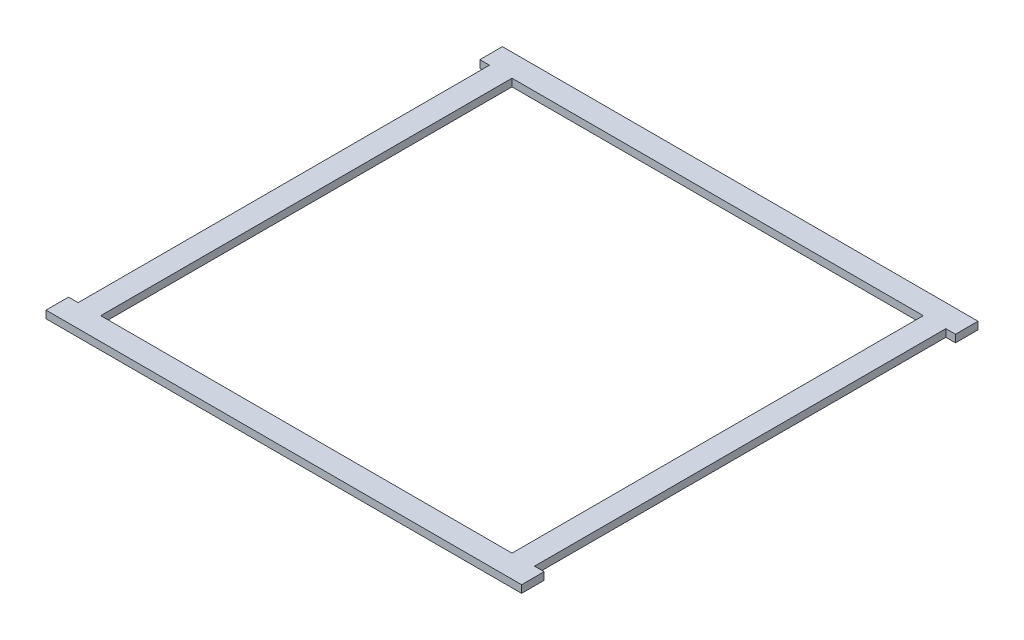
ISO-10303-21;
HEADER;
FILE_DESCRIPTION(('STEP AP214'),'2;1');
FILE_NAME('part.step','',(''),(''),'','','');
FILE_SCHEMA(('AUTOMOTIVE_DESIGN { 1 0 10303 214 1 1 1 1 }'));
ENDSEC;
DATA;
#1=APPLICATION_CONTEXT('core data for automotive mechanical design processes');
#2=APPLICATION_PROTOCOL_DEFINITION('international standard','automotive_design',2000,#1);
#3=PRODUCT_CONTEXT('',#1,'mechanical');
#4=PRODUCT('Part','Part','',(#3));
#5=PRODUCT_RELATED_PRODUCT_CATEGORY('part','',(#4));
#6=PRODUCT_DEFINITION_FORMATION('','',#4);
#7=PRODUCT_DEFINITION_CONTEXT('part definition',#1,'design');
#8=PRODUCT_DEFINITION('design','',#6,#7);
#9=PRODUCT_DEFINITION_SHAPE('','',#8);
#10=(LENGTH_UNIT() NAMED_UNIT(*) SI_UNIT(.MILLI.,.METRE.));
#11=(NAMED_UNIT(*) PLANE_ANGLE_UNIT() SI_UNIT($,.RADIAN.));
#12=(NAMED_UNIT(*) SI_UNIT($,.STERADIAN.) SOLID_ANGLE_UNIT());
#13=UNCERTAINTY_MEASURE_WITH_UNIT(LENGTH_MEASURE(1.E-05),#10,'distance_accuracy_value','');
#14=(GEOMETRIC_REPRESENTATION_CONTEXT(3) GLOBAL_UNCERTAINTY_ASSIGNED_CONTEXT((#13)) GLOBAL_UNIT_ASSIGNED_CONTEXT((#10,
#11,#12)) REPRESENTATION_CONTEXT('',''));
#15=CARTESIAN_POINT('',(0.,0.,0.));
#16=DIRECTION('',(0.,0.,1.));
#17=DIRECTION('',(1.,0.,0.));
#18=AXIS2_PLACEMENT_3D('',#15,#16,#17);
#19=CARTESIAN_POINT('',(19.05,0.,347.599));
#20=DIRECTION('',(0.,1.,0.));
#21=DIRECTION('',(0.,0.,1.));
#22=AXIS2_PLACEMENT_3D('',#19,#20,#21);
#23=PLANE('',#22);
#24=DIRECTION('',(-1.,0.,0.));
#25=VECTOR('',#24,1.);
#26=CARTESIAN_POINT('',(393.827,0.,0.));
#27=LINE('',#26,#25);
#28=CARTESIAN_POINT('',(19.05,0.,0.));
#29=VERTEX_POINT('',#28);
#30=CARTESIAN_POINT('',(366.649,0.,0.));
#31=VERTEX_POINT('',#30);
#32=EDGE_CURVE('E197',#29,#31,#27,.F.);
#33=ORIENTED_EDGE('',*,*,#32,.T.);
#34=DIRECTION('',(0.,0.,-1.));
#35=VECTOR('',#34,1.);
#36=CARTESIAN_POINT('',(366.649,0.,347.599));
#37=LINE('',#36,#35);
#38=CARTESIAN_POINT('',(366.649,0.,347.599));
#39=VERTEX_POINT('',#38);
#40=EDGE_CURVE('E202',#31,#39,#37,.F.);
#41=ORIENTED_EDGE('',*,*,#40,.T.);
#42=DIRECTION('',(1.,0.,0.));
#43=VECTOR('',#42,1.);
#44=CARTESIAN_POINT('',(-8.128,0.,347.599));
#45=LINE('',#44,#43);
#46=CARTESIAN_POINT('',(19.05,0.,347.599));
#47=VERTEX_POINT('',#46);
#48=EDGE_CURVE('E207',#39,#47,#45,.F.);
#49=ORIENTED_EDGE('',*,*,#48,.T.);
#50=DIRECTION('',(0.,0.,1.));
#51=VECTOR('',#50,1.);
#52=CARTESIAN_POINT('',(19.05,0.,347.599));
#53=LINE('',#52,#51);
#54=EDGE_CURVE('E213',#47,#29,#53,.F.);
#55=ORIENTED_EDGE('',*,*,#54,.T.);
#56=EDGE_LOOP('',(#33,#41,#49,#55));
#57=FACE_BOUND('',#56,.T.);
#58=DIRECTION('',(0.,0.,-1.));
#59=VECTOR('',#58,1.);
#60=CARTESIAN_POINT('',(-8.128,0.,0.));
#61=LINE('',#60,#59);
#62=CARTESIAN_POINT('',(-8.12799999999999,0.,-19.05));
#63=VERTEX_POINT('',#62);
#64=CARTESIAN_POINT('',(-8.12800000000001,0.,0.));
#65=VERTEX_POINT('',#64);
#66=EDGE_CURVE('E179',#63,#65,#61,.F.);
#67=ORIENTED_EDGE('',*,*,#66,.T.);
#68=DIRECTION('',(-1.,0.,0.));
#69=VECTOR('',#68,1.);
#70=CARTESIAN_POINT('',(393.827,0.,0.));
#71=LINE('',#70,#69);
#72=CARTESIAN_POINT('',(0.,0.,0.));
#73=VERTEX_POINT('',#72);
#74=EDGE_CURVE('E184',#65,#73,#71,.F.);
#75=ORIENTED_EDGE('',*,*,#74,.T.);
#76=DIRECTION('',(0.,0.,-1.));
#77=VECTOR('',#76,1.);
#78=CARTESIAN_POINT('',(0.,0.,347.599));
#79=LINE('',#78,#77);
#80=CARTESIAN_POINT('',(0.,0.,347.599));
#81=VERTEX_POINT('',#80);
#82=EDGE_CURVE('E189',#73,#81,#79,.F.);
#83=ORIENTED_EDGE('',*,*,#82,.T.);
#84=DIRECTION('',(1.,0.,0.));
#85=VECTOR('',#84,1.);
#86=CARTESIAN_POINT('',(-8.128,0.,347.599));
#87=LINE('',#86,#85);
#88=CARTESIAN_POINT('',(-8.12800000000001,0.,347.599));
#89=VERTEX_POINT('',#88);
#90=EDGE_CURVE('E130',#81,#89,#87,.F.);
#91=ORIENTED_EDGE('',*,*,#90,.T.);
#92=DIRECTION('',(0.,0.,-1.));
#93=VECTOR('',#92,1.);
#94=CARTESIAN_POINT('',(-8.128,0.,366.649));
#95=LINE('',#94,#93);
#96=CARTESIAN_POINT('',(-8.12800000000001,0.,366.649));
#97=VERTEX_POINT('',#96);
#98=EDGE_CURVE('E19',#89,#97,#95,.F.);
#99=ORIENTED_EDGE('',*,*,#98,.T.);
#100=DIRECTION('',(-1.,0.,0.));
#101=VECTOR('',#100,1.);
#102=CARTESIAN_POINT('',(393.827,0.,366.649));
#103=LINE('',#102,#101);
#104=CARTESIAN_POINT('',(393.827,0.,366.649));
#105=VERTEX_POINT('',#104);
#106=EDGE_CURVE('E126',#97,#105,#103,.F.);
#107=ORIENTED_EDGE('',*,*,#106,.T.);
#108=DIRECTION('',(0.,0.,1.));
#109=VECTOR('',#108,1.);
#110=CARTESIAN_POINT('',(393.827,0.,347.599));
#111=LINE('',#110,#109);
#112=CARTESIAN_POINT('',(393.827,0.,347.599));
#113=VERTEX_POINT('',#112);
#114=EDGE_CURVE('E148',#105,#113,#111,.F.);
#115=ORIENTED_EDGE('',*,*,#114,.T.);
#116=DIRECTION('',(1.,0.,0.));
#117=VECTOR('',#116,1.);
#118=CARTESIAN_POINT('',(-8.128,0.,347.599));
#119=LINE('',#118,#117);
#120=CARTESIAN_POINT('',(385.699,0.,347.599));
#121=VERTEX_POINT('',#120);
#122=EDGE_CURVE('E153',#113,#121,#119,.F.);
#123=ORIENTED_EDGE('',*,*,#122,.T.);
#124=DIRECTION('',(0.,0.,1.));
#125=VECTOR('',#124,1.);
#126=CARTESIAN_POINT('',(385.699,0.,5.27355936696949E-13));
#127=LINE('',#126,#125);
#128=CARTESIAN_POINT('',(385.699,0.,0.));
#129=VERTEX_POINT('',#128);
#130=EDGE_CURVE('E158',#121,#129,#127,.F.);
#131=ORIENTED_EDGE('',*,*,#130,.T.);
#132=DIRECTION('',(-1.,0.,0.));
#133=VECTOR('',#132,1.);
#134=CARTESIAN_POINT('',(393.827,0.,0.));
#135=LINE('',#134,#133);
#136=CARTESIAN_POINT('',(393.827,0.,0.));
#137=VERTEX_POINT('',#136);
#138=EDGE_CURVE('E161',#129,#137,#135,.F.);
#139=ORIENTED_EDGE('',*,*,#138,.T.);
#140=DIRECTION('',(0.,0.,1.));
#141=VECTOR('',#140,1.);
#142=CARTESIAN_POINT('',(393.827,0.,-19.05));
#143=LINE('',#142,#141);
#144=CARTESIAN_POINT('',(393.827,0.,-19.05));
#145=VERTEX_POINT('',#144);
#146=EDGE_CURVE('E169',#137,#145,#143,.F.);
#147=ORIENTED_EDGE('',*,*,#146,.T.);
#148=DIRECTION('',(1.,0.,0.));
#149=VECTOR('',#148,1.);
#150=CARTESIAN_POINT('',(-8.128,0.,-19.05));
#151=LINE('',#150,#149);
#152=EDGE_CURVE('E174',#145,#63,#151,.F.);
#153=ORIENTED_EDGE('',*,*,#152,.T.);
#154=EDGE_LOOP('',(#67,#75,#83,#91,#99,#107,#115,#123,#131,#139,#147,#153));
#155=FACE_BOUND('',#154,.T.);
#156=ADVANCED_FACE('F16',(#57,#155),#23,.T.);
#157=CARTESIAN_POINT('',(-8.128,-6.35,366.649));
#158=DIRECTION('',(1.,0.,0.));
#159=DIRECTION('',(0.,0.,-1.));
#160=AXIS2_PLACEMENT_3D('',#157,#158,#159);
#161=PLANE('',#160);
#162=DIRECTION('',(0.,1.,0.));
#163=VECTOR('',#162,1.);
#164=CARTESIAN_POINT('',(-8.128,-6.35,347.599));
#165=LINE('',#164,#163);
#166=CARTESIAN_POINT('',(-8.12800000000001,-6.35,347.599));
#167=VERTEX_POINT('',#166);
#168=EDGE_CURVE('E191',#89,#167,#165,.F.);
#169=ORIENTED_EDGE('',*,*,#168,.T.);
#170=DIRECTION('',(0.,0.,1.));
#171=VECTOR('',#170,1.);
#172=CARTESIAN_POINT('',(-8.128,-6.35,347.599));
#173=LINE('',#172,#171);
#174=CARTESIAN_POINT('',(-8.12800000000001,-6.35,366.649));
#175=VERTEX_POINT('',#174);
#176=EDGE_CURVE('E145',#167,#175,#173,.T.);
#177=ORIENTED_EDGE('',*,*,#176,.T.);
#178=DIRECTION('',(0.,1.,0.));
#179=VECTOR('',#178,1.);
#180=CARTESIAN_POINT('',(-8.12800000000002,-6.35,366.649));
#181=LINE('',#180,#179);
#182=EDGE_CURVE('E135',#175,#97,#181,.T.);
#183=ORIENTED_EDGE('',*,*,#182,.T.);
#184=ORIENTED_EDGE('',*,*,#98,.F.);
#185=EDGE_LOOP('',(#169,#177,#183,#184));
#186=FACE_BOUND('',#185,.T.);
#187=ADVANCED_FACE('F144',(#186),#161,.F.);
#188=CARTESIAN_POINT('',(393.827,-6.35,366.649));
#189=DIRECTION('',(0.,0.,-1.));
#190=DIRECTION('',(-1.,0.,0.));
#191=AXIS2_PLACEMENT_3D('',#188,#189,#190);
#192=PLANE('',#191);
#193=ORIENTED_EDGE('',*,*,#182,.F.);
#194=DIRECTION('',(1.,0.,0.));
#195=VECTOR('',#194,1.);
#196=CARTESIAN_POINT('',(19.05,-6.35,366.649));
#197=LINE('',#196,#195);
#198=CARTESIAN_POINT('',(393.827,-6.35,366.649));
#199=VERTEX_POINT('',#198);
#200=EDGE_CURVE('E217',#175,#199,#197,.T.);
#201=ORIENTED_EDGE('',*,*,#200,.T.);
#202=DIRECTION('',(0.,1.,0.));
#203=VECTOR('',#202,1.);
#204=CARTESIAN_POINT('',(393.827,-6.35,366.649));
#205=LINE('',#204,#203);
#206=EDGE_CURVE('E141',#199,#105,#205,.T.);
#207=ORIENTED_EDGE('',*,*,#206,.T.);
#208=ORIENTED_EDGE('',*,*,#106,.F.);
#209=EDGE_LOOP('',(#193,#201,#207,#208));
#210=FACE_BOUND('',#209,.T.);
#211=ADVANCED_FACE('F138',(#210),#192,.F.);
#212=CARTESIAN_POINT('',(393.827,-6.35,347.599));
#213=DIRECTION('',(-1.,0.,0.));
#214=DIRECTION('',(0.,0.,1.));
#215=AXIS2_PLACEMENT_3D('',#212,#213,#214);
#216=PLANE('',#215);
#217=ORIENTED_EDGE('',*,*,#206,.F.);
#218=DIRECTION('',(0.,0.,1.));
#219=VECTOR('',#218,1.);
#220=CARTESIAN_POINT('',(393.827,-6.35,347.599));
#221=LINE('',#220,#219);
#222=CARTESIAN_POINT('',(393.827,-6.35,347.599));
#223=VERTEX_POINT('',#222);
#224=EDGE_CURVE('E219',#199,#223,#221,.F.);
#225=ORIENTED_EDGE('',*,*,#224,.T.);
#226=DIRECTION('',(0.,1.,0.));
#227=VECTOR('',#226,1.);
#228=CARTESIAN_POINT('',(393.827,-6.35,347.599));
#229=LINE('',#228,#227);
#230=EDGE_CURVE('E150',#223,#113,#229,.T.);
#231=ORIENTED_EDGE('',*,*,#230,.T.);
#232=ORIENTED_EDGE('',*,*,#114,.F.);
#233=EDGE_LOOP('',(#217,#225,#231,#232));
#234=FACE_BOUND('',#233,.T.);
#235=ADVANCED_FACE('F320',(#234),#216,.F.);
#236=CARTESIAN_POINT('',(-8.128,-6.35,347.599));
#237=DIRECTION('',(0.,0.,1.));
#238=DIRECTION('',(1.,0.,0.));
#239=AXIS2_PLACEMENT_3D('',#236,#237,#238);
#240=PLANE('',#239);
#241=DIRECTION('',(0.,1.,0.));
#242=VECTOR('',#241,1.);
#243=CARTESIAN_POINT('',(385.698999999999,-6.35,347.599));
#244=LINE('',#243,#242);
#245=CARTESIAN_POINT('',(385.699,-6.35,347.599));
#246=VERTEX_POINT('',#245);
#247=EDGE_CURVE('E155',#246,#121,#244,.T.);
#248=ORIENTED_EDGE('',*,*,#247,.T.);
#249=ORIENTED_EDGE('',*,*,#122,.F.);
#250=ORIENTED_EDGE('',*,*,#230,.F.);
#251=DIRECTION('',(1.,0.,0.));
#252=VECTOR('',#251,1.);
#253=CARTESIAN_POINT('',(19.05,-6.35,347.599));
#254=LINE('',#253,#252);
#255=EDGE_CURVE('E222',#223,#246,#254,.F.);
#256=ORIENTED_EDGE('',*,*,#255,.T.);
#257=EDGE_LOOP('',(#248,#249,#250,#256));
#258=FACE_BOUND('',#257,.T.);
#259=ADVANCED_FACE('F316',(#258),#240,.F.);
#260=CARTESIAN_POINT('',(385.699,-6.35,5.27355936696949E-13));
#261=DIRECTION('',(-1.,0.,0.));
#262=DIRECTION('',(0.,0.,1.));
#263=AXIS2_PLACEMENT_3D('',#260,#261,#262);
#264=PLANE('',#263);
#265=ORIENTED_EDGE('',*,*,#247,.F.);
#266=DIRECTION('',(0.,0.,1.));
#267=VECTOR('',#266,1.);
#268=CARTESIAN_POINT('',(385.699,-6.35,347.599));
#269=LINE('',#268,#267);
#270=CARTESIAN_POINT('',(385.699,-6.35,0.));
#271=VERTEX_POINT('',#270);
#272=EDGE_CURVE('E225',#246,#271,#269,.F.);
#273=ORIENTED_EDGE('',*,*,#272,.T.);
#274=DIRECTION('',(0.,1.,0.));
#275=VECTOR('',#274,1.);
#276=CARTESIAN_POINT('',(385.699,-6.35,0.));
#277=LINE('',#276,#275);
#278=EDGE_CURVE('E163',#271,#129,#277,.T.);
#279=ORIENTED_EDGE('',*,*,#278,.T.);
#280=ORIENTED_EDGE('',*,*,#130,.F.);
#281=EDGE_LOOP('',(#265,#273,#279,#280));
#282=FACE_BOUND('',#281,.T.);
#283=ADVANCED_FACE('F312',(#282),#264,.F.);
#284=CARTESIAN_POINT('',(393.827,-6.35,0.));
#285=DIRECTION('',(0.,0.,-1.));
#286=DIRECTION('',(-1.,0.,0.));
#287=AXIS2_PLACEMENT_3D('',#284,#285,#286);
#288=PLANE('',#287);
#289=DIRECTION('',(1.,0.,0.));
#290=VECTOR('',#289,1.);
#291=CARTESIAN_POINT('',(19.05,-6.35,0.));
#292=LINE('',#291,#290);
#293=CARTESIAN_POINT('',(393.827,-6.35,0.));
#294=VERTEX_POINT('',#293);
#295=EDGE_CURVE('E228',#271,#294,#292,.T.);
#296=ORIENTED_EDGE('',*,*,#295,.T.);
#297=DIRECTION('',(0.,1.,0.));
#298=VECTOR('',#297,1.);
#299=CARTESIAN_POINT('',(393.827,-6.35,0.));
#300=LINE('',#299,#298);
#301=EDGE_CURVE('E166',#294,#137,#300,.T.);
#302=ORIENTED_EDGE('',*,*,#301,.T.);
#303=ORIENTED_EDGE('',*,*,#138,.F.);
#304=ORIENTED_EDGE('',*,*,#278,.F.);
#305=EDGE_LOOP('',(#296,#302,#303,#304));
#306=FACE_BOUND('',#305,.T.);
#307=ADVANCED_FACE('F308',(#306),#288,.F.);
#308=CARTESIAN_POINT('',(393.827,-6.35,-19.05));
#309=DIRECTION('',(-1.,0.,0.));
#310=DIRECTION('',(0.,0.,1.));
#311=AXIS2_PLACEMENT_3D('',#308,#309,#310);
#312=PLANE('',#311);
#313=ORIENTED_EDGE('',*,*,#301,.F.);
#314=DIRECTION('',(0.,0.,1.));
#315=VECTOR('',#314,1.);
#316=CARTESIAN_POINT('',(393.827,-6.35,347.599));
#317=LINE('',#316,#315);
#318=CARTESIAN_POINT('',(393.827,-6.35,-19.05));
#319=VERTEX_POINT('',#318);
#320=EDGE_CURVE('E231',#294,#319,#317,.F.);
#321=ORIENTED_EDGE('',*,*,#320,.T.);
#322=DIRECTION('',(0.,1.,0.));
#323=VECTOR('',#322,1.);
#324=CARTESIAN_POINT('',(393.827,-6.35,-19.05));
#325=LINE('',#324,#323);
#326=EDGE_CURVE('E171',#319,#145,#325,.T.);
#327=ORIENTED_EDGE('',*,*,#326,.T.);
#328=ORIENTED_EDGE('',*,*,#146,.F.);
#329=EDGE_LOOP('',(#313,#321,#327,#328));
#330=FACE_BOUND('',#329,.T.);
#331=ADVANCED_FACE('F304',(#330),#312,.F.);
#332=CARTESIAN_POINT('',(-8.128,-6.35,-19.05));
#333=DIRECTION('',(0.,0.,1.));
#334=DIRECTION('',(1.,0.,0.));
#335=AXIS2_PLACEMENT_3D('',#332,#333,#334);
#336=PLANE('',#335);
#337=ORIENTED_EDGE('',*,*,#326,.F.);
#338=DIRECTION('',(1.,0.,0.));
#339=VECTOR('',#338,1.);
#340=CARTESIAN_POINT('',(19.05,-6.35,-19.05));
#341=LINE('',#340,#339);
#342=CARTESIAN_POINT('',(-8.12799999999999,-6.35,-19.05));
#343=VERTEX_POINT('',#342);
#344=EDGE_CURVE('E234',#319,#343,#341,.F.);
#345=ORIENTED_EDGE('',*,*,#344,.T.);
#346=DIRECTION('',(0.,1.,0.));
#347=VECTOR('',#346,1.);
#348=CARTESIAN_POINT('',(-8.12799999999997,-6.35,-19.05));
#349=LINE('',#348,#347);
#350=EDGE_CURVE('E176',#343,#63,#349,.T.);
#351=ORIENTED_EDGE('',*,*,#350,.T.);
#352=ORIENTED_EDGE('',*,*,#152,.F.);
#353=EDGE_LOOP('',(#337,#345,#351,#352));
#354=FACE_BOUND('',#353,.T.);
#355=ADVANCED_FACE('F300',(#354),#336,.F.);
#356=CARTESIAN_POINT('',(-8.128,-6.35,0.));
#357=DIRECTION('',(1.,0.,0.));
#358=DIRECTION('',(0.,0.,-1.));
#359=AXIS2_PLACEMENT_3D('',#356,#357,#358);
#360=PLANE('',#359);
#361=ORIENTED_EDGE('',*,*,#350,.F.);
#362=DIRECTION('',(0.,0.,1.));
#363=VECTOR('',#362,1.);
#364=CARTESIAN_POINT('',(-8.128,-6.35,347.599));
#365=LINE('',#364,#363);
#366=CARTESIAN_POINT('',(-8.12800000000001,-6.35,0.));
#367=VERTEX_POINT('',#366);
#368=EDGE_CURVE('E237',#343,#367,#365,.T.);
#369=ORIENTED_EDGE('',*,*,#368,.T.);
#370=DIRECTION('',(0.,1.,0.));
#371=VECTOR('',#370,1.);
#372=CARTESIAN_POINT('',(-8.12800000000002,-6.35,0.));
#373=LINE('',#372,#371);
#374=EDGE_CURVE('E181',#367,#65,#373,.T.);
#375=ORIENTED_EDGE('',*,*,#374,.T.);
#376=ORIENTED_EDGE('',*,*,#66,.F.);
#377=EDGE_LOOP('',(#361,#369,#375,#376));
#378=FACE_BOUND('',#377,.T.);
#379=ADVANCED_FACE('F296',(#378),#360,.F.);
#380=CARTESIAN_POINT('',(393.827,-6.35,0.));
#381=DIRECTION('',(0.,0.,-1.));
#382=DIRECTION('',(-1.,0.,0.));
#383=AXIS2_PLACEMENT_3D('',#380,#381,#382);
#384=PLANE('',#383);
#385=DIRECTION('',(0.,1.,0.));
#386=VECTOR('',#385,1.);
#387=CARTESIAN_POINT('',(0.,-6.35,0.));
#388=LINE('',#387,#386);
#389=CARTESIAN_POINT('',(0.,-6.35,0.));
#390=VERTEX_POINT('',#389);
#391=EDGE_CURVE('E186',#390,#73,#388,.T.);
#392=ORIENTED_EDGE('',*,*,#391,.T.);
#393=ORIENTED_EDGE('',*,*,#74,.F.);
#394=ORIENTED_EDGE('',*,*,#374,.F.);
#395=DIRECTION('',(1.,0.,0.));
#396=VECTOR('',#395,1.);
#397=CARTESIAN_POINT('',(19.05,-6.35,0.));
#398=LINE('',#397,#396);
#399=EDGE_CURVE('E240',#367,#390,#398,.T.);
#400=ORIENTED_EDGE('',*,*,#399,.T.);
#401=EDGE_LOOP('',(#392,#393,#394,#400));
#402=FACE_BOUND('',#401,.T.);
#403=ADVANCED_FACE('F292',(#402),#384,.F.);
#404=CARTESIAN_POINT('',(0.,-6.35,347.599));
#405=DIRECTION('',(1.,0.,0.));
#406=DIRECTION('',(0.,0.,-1.));
#407=AXIS2_PLACEMENT_3D('',#404,#405,#406);
#408=PLANE('',#407);
#409=ORIENTED_EDGE('',*,*,#391,.F.);
#410=DIRECTION('',(0.,0.,1.));
#411=VECTOR('',#410,1.);
#412=CARTESIAN_POINT('',(0.,-6.35,347.599));
#413=LINE('',#412,#411);
#414=CARTESIAN_POINT('',(0.,-6.35,347.599));
#415=VERTEX_POINT('',#414);
#416=EDGE_CURVE('E243',#390,#415,#413,.T.);
#417=ORIENTED_EDGE('',*,*,#416,.T.);
#418=DIRECTION('',(0.,1.,0.));
#419=VECTOR('',#418,1.);
#420=CARTESIAN_POINT('',(0.,-6.35,347.599));
#421=LINE('',#420,#419);
#422=EDGE_CURVE('E193',#415,#81,#421,.T.);
#423=ORIENTED_EDGE('',*,*,#422,.T.);
#424=ORIENTED_EDGE('',*,*,#82,.F.);
#425=EDGE_LOOP('',(#409,#417,#423,#424));
#426=FACE_BOUND('',#425,.T.);
#427=ADVANCED_FACE('F288',(#426),#408,.F.);
#428=CARTESIAN_POINT('',(-8.128,-6.35,347.599));
#429=DIRECTION('',(0.,0.,1.));
#430=DIRECTION('',(1.,0.,0.));
#431=AXIS2_PLACEMENT_3D('',#428,#429,#430);
#432=PLANE('',#431);
#433=ORIENTED_EDGE('',*,*,#422,.F.);
#434=DIRECTION('',(1.,0.,0.));
#435=VECTOR('',#434,1.);
#436=CARTESIAN_POINT('',(19.05,-6.35,347.599));
#437=LINE('',#436,#435);
#438=EDGE_CURVE('E246',#415,#167,#437,.F.);
#439=ORIENTED_EDGE('',*,*,#438,.T.);
#440=ORIENTED_EDGE('',*,*,#168,.F.);
#441=ORIENTED_EDGE('',*,*,#90,.F.);
#442=EDGE_LOOP('',(#433,#439,#440,#441));
#443=FACE_BOUND('',#442,.T.);
#444=ADVANCED_FACE('F285',(#443),#432,.F.);
#445=CARTESIAN_POINT('',(393.827,-6.35,0.));
#446=DIRECTION('',(0.,0.,-1.));
#447=DIRECTION('',(-1.,0.,0.));
#448=AXIS2_PLACEMENT_3D('',#445,#446,#447);
#449=PLANE('',#448);
#450=ORIENTED_EDGE('',*,*,#32,.F.);
#451=DIRECTION('',(0.,1.,0.));
#452=VECTOR('',#451,1.);
#453=CARTESIAN_POINT('',(19.05,-6.35,0.));
#454=LINE('',#453,#452);
#455=CARTESIAN_POINT('',(19.05,-6.35,0.));
#456=VERTEX_POINT('',#455);
#457=EDGE_CURVE('E209',#29,#456,#454,.F.);
#458=ORIENTED_EDGE('',*,*,#457,.T.);
#459=DIRECTION('',(1.,0.,0.));
#460=VECTOR('',#459,1.);
#461=CARTESIAN_POINT('',(19.05,-6.35,0.));
#462=LINE('',#461,#460);
#463=CARTESIAN_POINT('',(366.649,-6.35,0.));
#464=VERTEX_POINT('',#463);
#465=EDGE_CURVE('E249',#456,#464,#462,.T.);
#466=ORIENTED_EDGE('',*,*,#465,.T.);
#467=DIRECTION('',(0.,1.,0.));
#468=VECTOR('',#467,1.);
#469=CARTESIAN_POINT('',(366.649000000001,-6.35,0.));
#470=LINE('',#469,#468);
#471=EDGE_CURVE('E199',#464,#31,#470,.T.);
#472=ORIENTED_EDGE('',*,*,#471,.T.);
#473=EDGE_LOOP('',(#450,#458,#466,#472));
#474=FACE_BOUND('',#473,.T.);
#475=ADVANCED_FACE('F268',(#474),#449,.F.);
#476=CARTESIAN_POINT('',(366.649,-6.35,347.599));
#477=DIRECTION('',(1.,0.,0.));
#478=DIRECTION('',(0.,0.,-1.));
#479=AXIS2_PLACEMENT_3D('',#476,#477,#478);
#480=PLANE('',#479);
#481=ORIENTED_EDGE('',*,*,#471,.F.);
#482=DIRECTION('',(0.,0.,1.));
#483=VECTOR('',#482,1.);
#484=CARTESIAN_POINT('',(366.649,-6.35,347.599));
#485=LINE('',#484,#483);
#486=CARTESIAN_POINT('',(366.649,-6.35,347.599));
#487=VERTEX_POINT('',#486);
#488=EDGE_CURVE('E252',#464,#487,#485,.T.);
#489=ORIENTED_EDGE('',*,*,#488,.T.);
#490=DIRECTION('',(0.,1.,0.));
#491=VECTOR('',#490,1.);
#492=CARTESIAN_POINT('',(366.649,-6.35,347.599));
#493=LINE('',#492,#491);
#494=EDGE_CURVE('E204',#487,#39,#493,.T.);
#495=ORIENTED_EDGE('',*,*,#494,.T.);
#496=ORIENTED_EDGE('',*,*,#40,.F.);
#497=EDGE_LOOP('',(#481,#489,#495,#496));
#498=FACE_BOUND('',#497,.T.);
#499=ADVANCED_FACE('F265',(#498),#480,.F.);
#500=CARTESIAN_POINT('',(-8.128,-6.35,347.599));
#501=DIRECTION('',(0.,0.,1.));
#502=DIRECTION('',(1.,0.,0.));
#503=AXIS2_PLACEMENT_3D('',#500,#501,#502);
#504=PLANE('',#503);
#505=DIRECTION('',(0.,1.,0.));
#506=VECTOR('',#505,1.);
#507=CARTESIAN_POINT('',(19.05,-6.35,347.599));
#508=LINE('',#507,#506);
#509=CARTESIAN_POINT('',(19.05,-6.35,347.599));
#510=VERTEX_POINT('',#509);
#511=EDGE_CURVE('E33',#510,#47,#508,.T.);
#512=ORIENTED_EDGE('',*,*,#511,.T.);
#513=ORIENTED_EDGE('',*,*,#48,.F.);
#514=ORIENTED_EDGE('',*,*,#494,.F.);
#515=DIRECTION('',(1.,0.,0.));
#516=VECTOR('',#515,1.);
#517=CARTESIAN_POINT('',(19.05,-6.35,347.599));
#518=LINE('',#517,#516);
#519=EDGE_CURVE('E25',#487,#510,#518,.F.);
#520=ORIENTED_EDGE('',*,*,#519,.T.);
#521=EDGE_LOOP('',(#512,#513,#514,#520));
#522=FACE_BOUND('',#521,.T.);
#523=ADVANCED_FACE('F258',(#522),#504,.F.);
#524=CARTESIAN_POINT('',(19.05,-6.35,347.599));
#525=DIRECTION('',(-1.,0.,0.));
#526=DIRECTION('',(0.,0.,1.));
#527=AXIS2_PLACEMENT_3D('',#524,#525,#526);
#528=PLANE('',#527);
#529=ORIENTED_EDGE('',*,*,#511,.F.);
#530=DIRECTION('',(0.,0.,1.));
#531=VECTOR('',#530,1.);
#532=CARTESIAN_POINT('',(19.05,-6.35,347.599));
#533=LINE('',#532,#531);
#534=EDGE_CURVE('E11',#510,#456,#533,.F.);
#535=ORIENTED_EDGE('',*,*,#534,.T.);
#536=ORIENTED_EDGE('',*,*,#457,.F.);
#537=ORIENTED_EDGE('',*,*,#54,.F.);
#538=EDGE_LOOP('',(#529,#535,#536,#537));
#539=FACE_BOUND('',#538,.T.);
#540=ADVANCED_FACE('F270',(#539),#528,.F.);
#541=CARTESIAN_POINT('',(19.05,-6.35,347.599));
#542=DIRECTION('',(0.,1.,0.));
#543=DIRECTION('',(0.,0.,1.));
#544=AXIS2_PLACEMENT_3D('',#541,#542,#543);
#545=PLANE('',#544);
#546=ORIENTED_EDGE('',*,*,#519,.F.);
#547=ORIENTED_EDGE('',*,*,#488,.F.);
#548=ORIENTED_EDGE('',*,*,#465,.F.);
#549=ORIENTED_EDGE('',*,*,#534,.F.);
#550=EDGE_LOOP('',(#546,#547,#548,#549));
#551=FACE_BOUND('',#550,.T.);
#552=ORIENTED_EDGE('',*,*,#416,.F.);
#553=ORIENTED_EDGE('',*,*,#399,.F.);
#554=ORIENTED_EDGE('',*,*,#368,.F.);
#555=ORIENTED_EDGE('',*,*,#344,.F.);
#556=ORIENTED_EDGE('',*,*,#320,.F.);
#557=ORIENTED_EDGE('',*,*,#295,.F.);
#558=ORIENTED_EDGE('',*,*,#272,.F.);
#559=ORIENTED_EDGE('',*,*,#255,.F.);
#560=ORIENTED_EDGE('',*,*,#224,.F.);
#561=ORIENTED_EDGE('',*,*,#200,.F.);
#562=ORIENTED_EDGE('',*,*,#176,.F.);
#563=ORIENTED_EDGE('',*,*,#438,.F.);
#564=EDGE_LOOP('',(#552,#553,#554,#555,#556,#557,#558,#559,#560,#561,#562,#563));
#565=FACE_BOUND('',#564,.T.);
#566=ADVANCED_FACE('F262',(#551,#565),#545,.F.);
#567=CLOSED_SHELL('',(#156,#187,#211,#235,#259,#283,#307,#331,#355,#379,#403,#427,#444,#475,
#499,#523,#540,#566));
#568=MANIFOLD_SOLID_BREP('B1',#567);
#569=ADVANCED_BREP_SHAPE_REPRESENTATION('',(#18,#568),#14);
#570=SHAPE_DEFINITION_REPRESENTATION(#9,#569);
ENDSEC;
END-ISO-10303-21;
